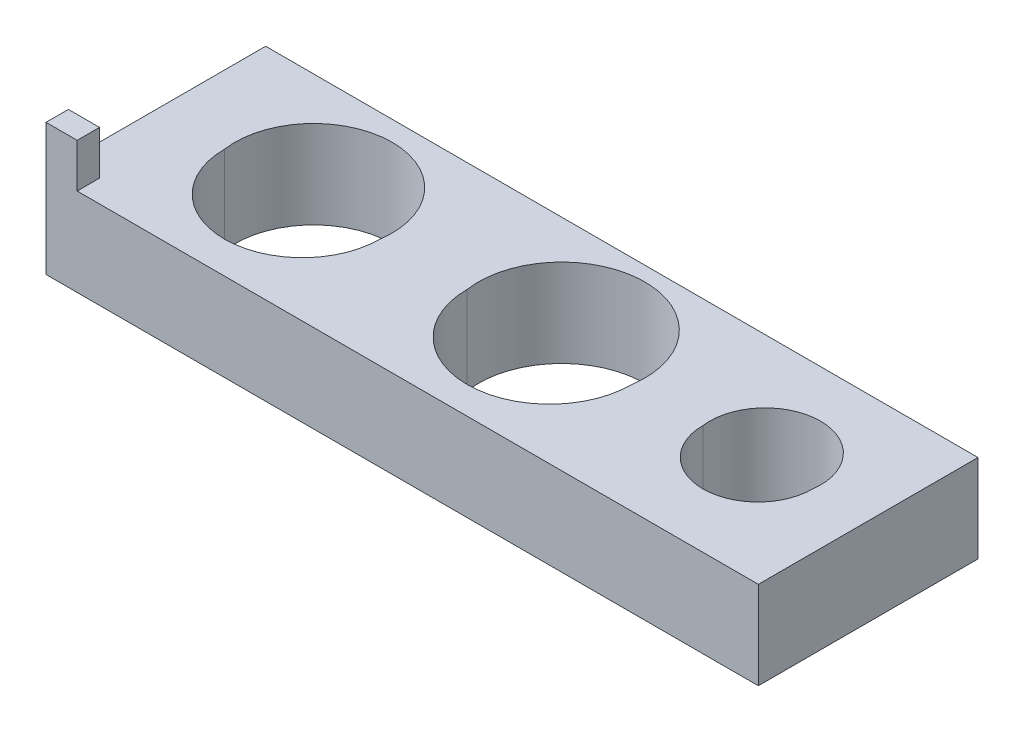
ISO-10303-21;
HEADER;
FILE_DESCRIPTION(('STEP AP214'),'2;1');
FILE_NAME('part.step','',(''),(''),'','','');
FILE_SCHEMA(('AUTOMOTIVE_DESIGN { 1 0 10303 214 1 1 1 1 }'));
ENDSEC;
DATA;
#1=APPLICATION_CONTEXT('core data for automotive mechanical design processes');
#2=APPLICATION_PROTOCOL_DEFINITION('international standard','automotive_design',2000,#1);
#3=PRODUCT_CONTEXT('',#1,'mechanical');
#4=PRODUCT('Part','Part','',(#3));
#5=PRODUCT_RELATED_PRODUCT_CATEGORY('part','',(#4));
#6=PRODUCT_DEFINITION_FORMATION('','',#4);
#7=PRODUCT_DEFINITION_CONTEXT('part definition',#1,'design');
#8=PRODUCT_DEFINITION('design','',#6,#7);
#9=PRODUCT_DEFINITION_SHAPE('','',#8);
#10=(LENGTH_UNIT() NAMED_UNIT(*) SI_UNIT(.MILLI.,.METRE.));
#11=(NAMED_UNIT(*) PLANE_ANGLE_UNIT() SI_UNIT($,.RADIAN.));
#12=(NAMED_UNIT(*) SI_UNIT($,.STERADIAN.) SOLID_ANGLE_UNIT());
#13=UNCERTAINTY_MEASURE_WITH_UNIT(LENGTH_MEASURE(1.E-05),#10,'distance_accuracy_value','');
#14=(GEOMETRIC_REPRESENTATION_CONTEXT(3) GLOBAL_UNCERTAINTY_ASSIGNED_CONTEXT((#13)) GLOBAL_UNIT_ASSIGNED_CONTEXT((#10,
#11,#12)) REPRESENTATION_CONTEXT('',''));
#15=CARTESIAN_POINT('',(0.,0.,0.));
#16=DIRECTION('',(0.,0.,1.));
#17=DIRECTION('',(1.,0.,0.));
#18=AXIS2_PLACEMENT_3D('',#15,#16,#17);
#19=CARTESIAN_POINT('',(31.722464109303,5.08,-6.76655938441402));
#20=DIRECTION('',(0.,-1.,0.));
#21=DIRECTION('',(0.,0.,-1.));
#22=AXIS2_PLACEMENT_3D('',#19,#20,#21);
#23=CYLINDRICAL_SURFACE('',#22,3.2022096622088);
#24=CARTESIAN_POINT('',(31.722464109303,0.,-6.76655938441402));
#25=DIRECTION('',(0.,1.,0.));
#26=DIRECTION('',(0.,0.,1.));
#27=AXIS2_PLACEMENT_3D('',#24,#25,#26);
#28=CIRCLE('',#27,3.2022096622088);
#29=CARTESIAN_POINT('',(28.547464109303,0.,-6.35));
#30=VERTEX_POINT('',#29);
#31=CARTESIAN_POINT('',(34.897464109303,0.,-6.35));
#32=VERTEX_POINT('',#31);
#33=EDGE_CURVE('E234',#30,#32,#28,.F.);
#34=ORIENTED_EDGE('',*,*,#33,.T.);
#35=DIRECTION('',(0.,-1.,0.));
#36=VECTOR('',#35,1.);
#37=CARTESIAN_POINT('',(34.897464109303,5.08,-6.35));
#38=LINE('',#37,#36);
#39=CARTESIAN_POINT('',(34.897464109303,5.08,-6.35));
#40=VERTEX_POINT('',#39);
#41=EDGE_CURVE('E12',#40,#32,#38,.T.);
#42=ORIENTED_EDGE('',*,*,#41,.F.);
#43=CARTESIAN_POINT('',(31.722464109303,5.08,-6.76655938441402));
#44=DIRECTION('',(0.,1.,0.));
#45=DIRECTION('',(0.,0.,1.));
#46=AXIS2_PLACEMENT_3D('',#43,#44,#45);
#47=CIRCLE('',#46,3.2022096622088);
#48=CARTESIAN_POINT('',(28.547464109303,5.08,-6.35));
#49=VERTEX_POINT('',#48);
#50=EDGE_CURVE('E208',#49,#40,#47,.F.);
#51=ORIENTED_EDGE('',*,*,#50,.F.);
#52=DIRECTION('',(0.,-1.,0.));
#53=VECTOR('',#52,1.);
#54=CARTESIAN_POINT('',(28.547464109303,5.08,-6.35));
#55=LINE('',#54,#53);
#56=EDGE_CURVE('E68',#49,#30,#55,.T.);
#57=ORIENTED_EDGE('',*,*,#56,.T.);
#58=EDGE_LOOP('',(#34,#42,#51,#57));
#59=FACE_BOUND('',#58,.T.);
#60=ADVANCED_FACE('F59',(#59),#23,.F.);
#61=CARTESIAN_POINT('',(38.1,5.08,0.));
#62=DIRECTION('',(-1.,0.,0.));
#63=DIRECTION('',(0.,0.,1.));
#64=AXIS2_PLACEMENT_3D('',#61,#62,#63);
#65=PLANE('',#64);
#66=DIRECTION('',(0.,0.,-1.));
#67=VECTOR('',#66,1.);
#68=CARTESIAN_POINT('',(38.1,0.,0.));
#69=LINE('',#68,#67);
#70=CARTESIAN_POINT('',(38.1,0.,0.));
#71=VERTEX_POINT('',#70);
#72=CARTESIAN_POINT('',(38.1,0.,-12.7));
#73=VERTEX_POINT('',#72);
#74=EDGE_CURVE('E226',#71,#73,#69,.T.);
#75=ORIENTED_EDGE('',*,*,#74,.T.);
#76=DIRECTION('',(0.,-1.,0.));
#77=VECTOR('',#76,1.);
#78=CARTESIAN_POINT('',(38.1,5.08,-12.7));
#79=LINE('',#78,#77);
#80=CARTESIAN_POINT('',(38.1,5.08,-12.7));
#81=VERTEX_POINT('',#80);
#82=EDGE_CURVE('E239',#81,#73,#79,.T.);
#83=ORIENTED_EDGE('',*,*,#82,.F.);
#84=DIRECTION('',(0.,0.,-1.));
#85=VECTOR('',#84,1.);
#86=CARTESIAN_POINT('',(38.1,5.08,0.));
#87=LINE('',#86,#85);
#88=CARTESIAN_POINT('',(38.1,5.08,0.));
#89=VERTEX_POINT('',#88);
#90=EDGE_CURVE('E201',#89,#81,#87,.T.);
#91=ORIENTED_EDGE('',*,*,#90,.F.);
#92=DIRECTION('',(0.,-1.,0.));
#93=VECTOR('',#92,1.);
#94=CARTESIAN_POINT('',(38.1,5.08,0.));
#95=LINE('',#94,#93);
#96=EDGE_CURVE('E241',#89,#71,#95,.T.);
#97=ORIENTED_EDGE('',*,*,#96,.T.);
#98=EDGE_LOOP('',(#75,#83,#91,#97));
#99=FACE_BOUND('',#98,.T.);
#100=ADVANCED_FACE('F262',(#99),#65,.F.);
#101=CARTESIAN_POINT('',(0.,5.08,-12.7));
#102=DIRECTION('',(0.,0.,-1.));
#103=DIRECTION('',(-1.,0.,0.));
#104=AXIS2_PLACEMENT_3D('',#101,#102,#103);
#105=PLANE('',#104);
#106=DIRECTION('',(1.,0.,0.));
#107=VECTOR('',#106,1.);
#108=CARTESIAN_POINT('',(0.,0.,-12.7));
#109=LINE('',#108,#107);
#110=CARTESIAN_POINT('',(-3.08576312716724,0.,-12.7));
#111=VERTEX_POINT('',#110);
#112=EDGE_CURVE('E229',#111,#73,#109,.T.);
#113=ORIENTED_EDGE('',*,*,#112,.F.);
#114=DIRECTION('',(0.,-1.,0.));
#115=VECTOR('',#114,1.);
#116=CARTESIAN_POINT('',(-3.08576312716724,5.08,-12.7));
#117=LINE('',#116,#115);
#118=CARTESIAN_POINT('',(-3.08576312716724,5.08,-12.7));
#119=VERTEX_POINT('',#118);
#120=EDGE_CURVE('E163',#119,#111,#117,.T.);
#121=ORIENTED_EDGE('',*,*,#120,.F.);
#122=DIRECTION('',(1.,0.,0.));
#123=VECTOR('',#122,1.);
#124=CARTESIAN_POINT('',(0.,5.08,-12.7));
#125=LINE('',#124,#123);
#126=EDGE_CURVE('E203',#119,#81,#125,.T.);
#127=ORIENTED_EDGE('',*,*,#126,.T.);
#128=ORIENTED_EDGE('',*,*,#82,.T.);
#129=EDGE_LOOP('',(#113,#121,#127,#128));
#130=FACE_BOUND('',#129,.T.);
#131=ADVANCED_FACE('F291',(#130),#105,.T.);
#132=CARTESIAN_POINT('',(5.37983622513507,5.08,-6.35));
#133=DIRECTION('',(0.,-1.,0.));
#134=DIRECTION('',(0.,0.,-1.));
#135=AXIS2_PLACEMENT_3D('',#132,#133,#134);
#136=CYLINDRICAL_SURFACE('',#135,4.5);
#137=CARTESIAN_POINT('',(5.37983622513507,0.,-6.35));
#138=DIRECTION('',(0.,1.,0.));
#139=DIRECTION('',(0.,0.,1.));
#140=AXIS2_PLACEMENT_3D('',#137,#138,#139);
#141=CIRCLE('',#140,4.5);
#142=CARTESIAN_POINT('',(0.879836225135068,0.,-6.35));
#143=VERTEX_POINT('',#142);
#144=CARTESIAN_POINT('',(9.87983622513507,0.,-6.35));
#145=VERTEX_POINT('',#144);
#146=EDGE_CURVE('E220',#143,#145,#141,.T.);
#147=ORIENTED_EDGE('',*,*,#146,.F.);
#148=DIRECTION('',(0.,-1.,0.));
#149=VECTOR('',#148,1.);
#150=CARTESIAN_POINT('',(0.879836225135068,5.08,-6.35));
#151=LINE('',#150,#149);
#152=CARTESIAN_POINT('',(0.879836225135068,5.08,-6.35));
#153=VERTEX_POINT('',#152);
#154=EDGE_CURVE('E244',#153,#143,#151,.T.);
#155=ORIENTED_EDGE('',*,*,#154,.F.);
#156=CARTESIAN_POINT('',(5.37983622513507,5.08,-6.35));
#157=DIRECTION('',(0.,1.,0.));
#158=DIRECTION('',(0.,0.,1.));
#159=AXIS2_PLACEMENT_3D('',#156,#157,#158);
#160=CIRCLE('',#159,4.5);
#161=CARTESIAN_POINT('',(9.87983622513507,5.08,-6.35));
#162=VERTEX_POINT('',#161);
#163=EDGE_CURVE('E196',#153,#162,#160,.T.);
#164=ORIENTED_EDGE('',*,*,#163,.T.);
#165=DIRECTION('',(0.,-1.,0.));
#166=VECTOR('',#165,1.);
#167=CARTESIAN_POINT('',(9.87983622513507,5.08,-6.35));
#168=LINE('',#167,#166);
#169=EDGE_CURVE('E246',#162,#145,#168,.T.);
#170=ORIENTED_EDGE('',*,*,#169,.T.);
#171=EDGE_LOOP('',(#147,#155,#164,#170));
#172=FACE_BOUND('',#171,.T.);
#173=ADVANCED_FACE('F301',(#172),#136,.F.);
#174=CARTESIAN_POINT('',(19.6778662624865,5.08,-6.35));
#175=DIRECTION('',(0.,-1.,0.));
#176=DIRECTION('',(0.,0.,-1.));
#177=AXIS2_PLACEMENT_3D('',#174,#175,#176);
#178=CYLINDRICAL_SURFACE('',#177,4.7625);
#179=CARTESIAN_POINT('',(19.6778662624865,0.,-6.35));
#180=DIRECTION('',(0.,1.,0.));
#181=DIRECTION('',(0.,0.,1.));
#182=AXIS2_PLACEMENT_3D('',#179,#180,#181);
#183=CIRCLE('',#182,4.7625);
#184=CARTESIAN_POINT('',(14.9153662624865,0.,-6.35));
#185=VERTEX_POINT('',#184);
#186=CARTESIAN_POINT('',(24.4403662624865,0.,-6.35));
#187=VERTEX_POINT('',#186);
#188=EDGE_CURVE('E214',#185,#187,#183,.T.);
#189=ORIENTED_EDGE('',*,*,#188,.F.);
#190=DIRECTION('',(0.,-1.,0.));
#191=VECTOR('',#190,1.);
#192=CARTESIAN_POINT('',(14.9153662624865,5.08,-6.35));
#193=LINE('',#192,#191);
#194=CARTESIAN_POINT('',(14.9153662624865,5.08,-6.35));
#195=VERTEX_POINT('',#194);
#196=EDGE_CURVE('E248',#195,#185,#193,.T.);
#197=ORIENTED_EDGE('',*,*,#196,.F.);
#198=CARTESIAN_POINT('',(19.6778662624865,5.08,-6.35));
#199=DIRECTION('',(0.,1.,0.));
#200=DIRECTION('',(0.,0.,1.));
#201=AXIS2_PLACEMENT_3D('',#198,#199,#200);
#202=CIRCLE('',#201,4.7625);
#203=CARTESIAN_POINT('',(24.4403662624865,5.08,-6.35));
#204=VERTEX_POINT('',#203);
#205=EDGE_CURVE('E190',#195,#204,#202,.T.);
#206=ORIENTED_EDGE('',*,*,#205,.T.);
#207=DIRECTION('',(0.,-1.,0.));
#208=VECTOR('',#207,1.);
#209=CARTESIAN_POINT('',(24.4403662624865,5.08,-6.35));
#210=LINE('',#209,#208);
#211=EDGE_CURVE('E213',#204,#187,#210,.T.);
#212=ORIENTED_EDGE('',*,*,#211,.T.);
#213=EDGE_LOOP('',(#189,#197,#206,#212));
#214=FACE_BOUND('',#213,.T.);
#215=ADVANCED_FACE('F299',(#214),#178,.F.);
#216=CARTESIAN_POINT('',(0.,5.08,0.));
#217=DIRECTION('',(0.,0.,-1.));
#218=DIRECTION('',(-1.,0.,0.));
#219=AXIS2_PLACEMENT_3D('',#216,#217,#218);
#220=PLANE('',#219);
#221=DIRECTION('',(1.,0.,0.));
#222=VECTOR('',#221,1.);
#223=CARTESIAN_POINT('',(0.,0.,0.));
#224=LINE('',#223,#222);
#225=CARTESIAN_POINT('',(-3.08576312716724,0.,0.));
#226=VERTEX_POINT('',#225);
#227=EDGE_CURVE('E232',#226,#71,#224,.T.);
#228=ORIENTED_EDGE('',*,*,#227,.T.);
#229=ORIENTED_EDGE('',*,*,#96,.F.);
#230=DIRECTION('',(1.,0.,0.));
#231=VECTOR('',#230,1.);
#232=CARTESIAN_POINT('',(0.,5.08,0.));
#233=LINE('',#232,#231);
#234=CARTESIAN_POINT('',(-1.28391911144377,5.08,0.));
#235=VERTEX_POINT('',#234);
#236=EDGE_CURVE('E206',#235,#89,#233,.T.);
#237=ORIENTED_EDGE('',*,*,#236,.F.);
#238=DIRECTION('',(0.,-1.,0.));
#239=VECTOR('',#238,1.);
#240=CARTESIAN_POINT('',(-1.28391911144377,7.62,0.));
#241=LINE('',#240,#239);
#242=CARTESIAN_POINT('',(-1.28391911144377,7.62,0.));
#243=VERTEX_POINT('',#242);
#244=EDGE_CURVE('E168',#243,#235,#241,.T.);
#245=ORIENTED_EDGE('',*,*,#244,.F.);
#246=DIRECTION('',(1.,0.,0.));
#247=VECTOR('',#246,1.);
#248=CARTESIAN_POINT('',(-3.08576312716724,7.62,0.));
#249=LINE('',#248,#247);
#250=CARTESIAN_POINT('',(-3.08576312716724,7.62,0.));
#251=VERTEX_POINT('',#250);
#252=EDGE_CURVE('E165',#251,#243,#249,.T.);
#253=ORIENTED_EDGE('',*,*,#252,.F.);
#254=DIRECTION('',(0.,-1.,0.));
#255=VECTOR('',#254,1.);
#256=CARTESIAN_POINT('',(-3.08576312716724,5.08,0.));
#257=LINE('',#256,#255);
#258=EDGE_CURVE('E63',#251,#226,#257,.T.);
#259=ORIENTED_EDGE('',*,*,#258,.T.);
#260=EDGE_LOOP('',(#228,#229,#237,#245,#253,#259));
#261=FACE_BOUND('',#260,.T.);
#262=ADVANCED_FACE('F166',(#261),#220,.F.);
#263=CARTESIAN_POINT('',(5.37983622513507,5.08,-7.00288000787659));
#264=DIRECTION('',(0.,-1.,0.));
#265=DIRECTION('',(0.,0.,-1.));
#266=AXIS2_PLACEMENT_3D('',#263,#264,#265);
#267=CYLINDRICAL_SURFACE('',#266,4.54711472306175);
#268=CARTESIAN_POINT('',(5.37983622513507,0.,-7.00288000787659));
#269=DIRECTION('',(0.,1.,0.));
#270=DIRECTION('',(0.,0.,1.));
#271=AXIS2_PLACEMENT_3D('',#268,#269,#270);
#272=CIRCLE('',#271,4.54711472306175);
#273=EDGE_CURVE('E223',#143,#145,#272,.F.);
#274=ORIENTED_EDGE('',*,*,#273,.T.);
#275=ORIENTED_EDGE('',*,*,#169,.F.);
#276=CARTESIAN_POINT('',(5.37983622513507,5.08,-7.00288000787659));
#277=DIRECTION('',(0.,1.,0.));
#278=DIRECTION('',(0.,0.,1.));
#279=AXIS2_PLACEMENT_3D('',#276,#277,#278);
#280=CIRCLE('',#279,4.54711472306175);
#281=EDGE_CURVE('E199',#153,#162,#280,.F.);
#282=ORIENTED_EDGE('',*,*,#281,.F.);
#283=ORIENTED_EDGE('',*,*,#154,.T.);
#284=EDGE_LOOP('',(#274,#275,#282,#283));
#285=FACE_BOUND('',#284,.T.);
#286=ADVANCED_FACE('F298',(#285),#267,.F.);
#287=CARTESIAN_POINT('',(19.6778662624865,5.08,-7.04753058612249));
#288=DIRECTION('',(0.,-1.,0.));
#289=DIRECTION('',(0.,0.,-1.));
#290=AXIS2_PLACEMENT_3D('',#287,#288,#289);
#291=CYLINDRICAL_SURFACE('',#290,4.81331020905326);
#292=CARTESIAN_POINT('',(19.6778662624865,0.,-7.04753058612249));
#293=DIRECTION('',(0.,1.,0.));
#294=DIRECTION('',(0.,0.,1.));
#295=AXIS2_PLACEMENT_3D('',#292,#293,#294);
#296=CIRCLE('',#295,4.81331020905326);
#297=EDGE_CURVE('E217',#185,#187,#296,.F.);
#298=ORIENTED_EDGE('',*,*,#297,.T.);
#299=ORIENTED_EDGE('',*,*,#211,.F.);
#300=CARTESIAN_POINT('',(19.6778662624865,5.08,-7.04753058612249));
#301=DIRECTION('',(0.,1.,0.));
#302=DIRECTION('',(0.,0.,1.));
#303=AXIS2_PLACEMENT_3D('',#300,#301,#302);
#304=CIRCLE('',#303,4.81331020905326);
#305=EDGE_CURVE('E193',#195,#204,#304,.F.);
#306=ORIENTED_EDGE('',*,*,#305,.F.);
#307=ORIENTED_EDGE('',*,*,#196,.T.);
#308=EDGE_LOOP('',(#298,#299,#306,#307));
#309=FACE_BOUND('',#308,.T.);
#310=ADVANCED_FACE('F305',(#309),#291,.F.);
#311=CARTESIAN_POINT('',(31.722464109303,5.08,-6.35));
#312=DIRECTION('',(0.,-1.,0.));
#313=DIRECTION('',(0.,0.,-1.));
#314=AXIS2_PLACEMENT_3D('',#311,#312,#313);
#315=CYLINDRICAL_SURFACE('',#314,3.175);
#316=CARTESIAN_POINT('',(31.722464109303,0.,-6.35));
#317=DIRECTION('',(0.,1.,0.));
#318=DIRECTION('',(0.,0.,1.));
#319=AXIS2_PLACEMENT_3D('',#316,#317,#318);
#320=CIRCLE('',#319,3.175);
#321=EDGE_CURVE('E194',#30,#32,#320,.T.);
#322=ORIENTED_EDGE('',*,*,#321,.F.);
#323=ORIENTED_EDGE('',*,*,#56,.F.);
#324=CARTESIAN_POINT('',(31.722464109303,5.08,-6.35));
#325=DIRECTION('',(0.,1.,0.));
#326=DIRECTION('',(0.,0.,1.));
#327=AXIS2_PLACEMENT_3D('',#324,#325,#326);
#328=CIRCLE('',#327,3.175);
#329=EDGE_CURVE('E210',#49,#40,#328,.T.);
#330=ORIENTED_EDGE('',*,*,#329,.T.);
#331=ORIENTED_EDGE('',*,*,#41,.T.);
#332=EDGE_LOOP('',(#322,#323,#330,#331));
#333=FACE_BOUND('',#332,.T.);
#334=ADVANCED_FACE('F295',(#333),#315,.F.);
#335=CARTESIAN_POINT('',(0.,5.08,0.));
#336=DIRECTION('',(0.,1.,0.));
#337=DIRECTION('',(0.,0.,1.));
#338=AXIS2_PLACEMENT_3D('',#335,#336,#337);
#339=PLANE('',#338);
#340=DIRECTION('',(-1.,0.,0.));
#341=VECTOR('',#340,1.);
#342=CARTESIAN_POINT('',(-3.08576312716724,5.08,-1.29407743261112));
#343=LINE('',#342,#341);
#344=CARTESIAN_POINT('',(-1.28391911144377,5.08,-1.29407743261112));
#345=VERTEX_POINT('',#344);
#346=CARTESIAN_POINT('',(-3.08576312716724,5.08,-1.29407743261112));
#347=VERTEX_POINT('',#346);
#348=EDGE_CURVE('E177',#345,#347,#343,.T.);
#349=ORIENTED_EDGE('',*,*,#348,.F.);
#350=DIRECTION('',(0.,0.,-1.));
#351=VECTOR('',#350,1.);
#352=CARTESIAN_POINT('',(-1.28391911144377,5.08,0.));
#353=LINE('',#352,#351);
#354=EDGE_CURVE('E76',#235,#345,#353,.T.);
#355=ORIENTED_EDGE('',*,*,#354,.F.);
#356=ORIENTED_EDGE('',*,*,#236,.T.);
#357=ORIENTED_EDGE('',*,*,#90,.T.);
#358=ORIENTED_EDGE('',*,*,#126,.F.);
#359=DIRECTION('',(0.,0.,1.));
#360=VECTOR('',#359,1.);
#361=CARTESIAN_POINT('',(-3.08576312716724,5.08,-12.7));
#362=LINE('',#361,#360);
#363=EDGE_CURVE('E82',#119,#347,#362,.T.);
#364=ORIENTED_EDGE('',*,*,#363,.T.);
#365=EDGE_LOOP('',(#349,#355,#356,#357,#358,#364));
#366=FACE_BOUND('',#365,.T.);
#367=ORIENTED_EDGE('',*,*,#205,.F.);
#368=ORIENTED_EDGE('',*,*,#305,.T.);
#369=EDGE_LOOP('',(#367,#368));
#370=FACE_BOUND('',#369,.T.);
#371=ORIENTED_EDGE('',*,*,#163,.F.);
#372=ORIENTED_EDGE('',*,*,#281,.T.);
#373=EDGE_LOOP('',(#371,#372));
#374=FACE_BOUND('',#373,.T.);
#375=ORIENTED_EDGE('',*,*,#50,.T.);
#376=ORIENTED_EDGE('',*,*,#329,.F.);
#377=EDGE_LOOP('',(#375,#376));
#378=FACE_BOUND('',#377,.T.);
#379=ADVANCED_FACE('F264',(#366,#370,#374,#378),#339,.T.);
#380=CARTESIAN_POINT('',(0.,0.,0.));
#381=DIRECTION('',(0.,1.,0.));
#382=DIRECTION('',(0.,0.,1.));
#383=AXIS2_PLACEMENT_3D('',#380,#381,#382);
#384=PLANE('',#383);
#385=ORIENTED_EDGE('',*,*,#188,.T.);
#386=ORIENTED_EDGE('',*,*,#297,.F.);
#387=EDGE_LOOP('',(#385,#386));
#388=FACE_BOUND('',#387,.T.);
#389=ORIENTED_EDGE('',*,*,#146,.T.);
#390=ORIENTED_EDGE('',*,*,#273,.F.);
#391=EDGE_LOOP('',(#389,#390));
#392=FACE_BOUND('',#391,.T.);
#393=ORIENTED_EDGE('',*,*,#74,.F.);
#394=ORIENTED_EDGE('',*,*,#227,.F.);
#395=DIRECTION('',(0.,0.,1.));
#396=VECTOR('',#395,1.);
#397=CARTESIAN_POINT('',(-3.08576312716724,0.,-12.7));
#398=LINE('',#397,#396);
#399=EDGE_CURVE('E161',#111,#226,#398,.T.);
#400=ORIENTED_EDGE('',*,*,#399,.F.);
#401=ORIENTED_EDGE('',*,*,#112,.T.);
#402=EDGE_LOOP('',(#393,#394,#400,#401));
#403=FACE_BOUND('',#402,.T.);
#404=ORIENTED_EDGE('',*,*,#33,.F.);
#405=ORIENTED_EDGE('',*,*,#321,.T.);
#406=EDGE_LOOP('',(#404,#405));
#407=FACE_BOUND('',#406,.T.);
#408=ADVANCED_FACE('F257',(#388,#392,#403,#407),#384,.F.);
#409=CARTESIAN_POINT('',(-3.08576312716724,5.08,-12.7));
#410=DIRECTION('',(1.,0.,0.));
#411=DIRECTION('',(0.,0.,-1.));
#412=AXIS2_PLACEMENT_3D('',#409,#410,#411);
#413=PLANE('',#412);
#414=ORIENTED_EDGE('',*,*,#399,.T.);
#415=ORIENTED_EDGE('',*,*,#258,.F.);
#416=DIRECTION('',(0.,0.,1.));
#417=VECTOR('',#416,1.);
#418=CARTESIAN_POINT('',(-3.08576312716724,7.62,0.));
#419=LINE('',#418,#417);
#420=CARTESIAN_POINT('',(-3.08576312716724,7.62,-1.29407743261112));
#421=VERTEX_POINT('',#420);
#422=EDGE_CURVE('E158',#421,#251,#419,.T.);
#423=ORIENTED_EDGE('',*,*,#422,.F.);
#424=DIRECTION('',(0.,-1.,0.));
#425=VECTOR('',#424,1.);
#426=CARTESIAN_POINT('',(-3.08576312716724,7.62,-1.29407743261112));
#427=LINE('',#426,#425);
#428=EDGE_CURVE('E183',#421,#347,#427,.T.);
#429=ORIENTED_EDGE('',*,*,#428,.T.);
#430=ORIENTED_EDGE('',*,*,#363,.F.);
#431=ORIENTED_EDGE('',*,*,#120,.T.);
#432=EDGE_LOOP('',(#414,#415,#423,#429,#430,#431));
#433=FACE_BOUND('',#432,.T.);
#434=ADVANCED_FACE('F61',(#433),#413,.F.);
#435=CARTESIAN_POINT('',(-1.28391911144377,7.62,0.));
#436=DIRECTION('',(-1.,0.,0.));
#437=DIRECTION('',(0.,0.,1.));
#438=AXIS2_PLACEMENT_3D('',#435,#436,#437);
#439=PLANE('',#438);
#440=ORIENTED_EDGE('',*,*,#354,.T.);
#441=DIRECTION('',(0.,-1.,0.));
#442=VECTOR('',#441,1.);
#443=CARTESIAN_POINT('',(-1.28391911144377,7.62,-1.29407743261112));
#444=LINE('',#443,#442);
#445=CARTESIAN_POINT('',(-1.28391911144377,7.62,-1.29407743261112));
#446=VERTEX_POINT('',#445);
#447=EDGE_CURVE('E186',#446,#345,#444,.T.);
#448=ORIENTED_EDGE('',*,*,#447,.F.);
#449=DIRECTION('',(0.,0.,-1.));
#450=VECTOR('',#449,1.);
#451=CARTESIAN_POINT('',(-1.28391911144377,7.62,0.));
#452=LINE('',#451,#450);
#453=EDGE_CURVE('E171',#243,#446,#452,.T.);
#454=ORIENTED_EDGE('',*,*,#453,.F.);
#455=ORIENTED_EDGE('',*,*,#244,.T.);
#456=EDGE_LOOP('',(#440,#448,#454,#455));
#457=FACE_BOUND('',#456,.T.);
#458=ADVANCED_FACE('F267',(#457),#439,.F.);
#459=CARTESIAN_POINT('',(-3.08576312716724,7.62,-1.29407743261112));
#460=DIRECTION('',(0.,0.,1.));
#461=DIRECTION('',(1.,0.,0.));
#462=AXIS2_PLACEMENT_3D('',#459,#460,#461);
#463=PLANE('',#462);
#464=ORIENTED_EDGE('',*,*,#348,.T.);
#465=ORIENTED_EDGE('',*,*,#428,.F.);
#466=DIRECTION('',(-1.,0.,0.));
#467=VECTOR('',#466,1.);
#468=CARTESIAN_POINT('',(-3.08576312716724,7.62,-1.29407743261112));
#469=LINE('',#468,#467);
#470=EDGE_CURVE('E175',#446,#421,#469,.T.);
#471=ORIENTED_EDGE('',*,*,#470,.F.);
#472=ORIENTED_EDGE('',*,*,#447,.T.);
#473=EDGE_LOOP('',(#464,#465,#471,#472));
#474=FACE_BOUND('',#473,.T.);
#475=ADVANCED_FACE('F270',(#474),#463,.F.);
#476=CARTESIAN_POINT('',(0.,7.62,0.));
#477=DIRECTION('',(0.,-1.,0.));
#478=DIRECTION('',(0.,0.,-1.));
#479=AXIS2_PLACEMENT_3D('',#476,#477,#478);
#480=PLANE('',#479);
#481=ORIENTED_EDGE('',*,*,#422,.T.);
#482=ORIENTED_EDGE('',*,*,#252,.T.);
#483=ORIENTED_EDGE('',*,*,#453,.T.);
#484=ORIENTED_EDGE('',*,*,#470,.T.);
#485=EDGE_LOOP('',(#481,#482,#483,#484));
#486=FACE_BOUND('',#485,.T.);
#487=ADVANCED_FACE('F173',(#486),#480,.F.);
#488=CLOSED_SHELL('',(#60,#100,#131,#173,#215,#262,#286,#310,#334,#379,#408,#434,#458,#475,#487));
#489=MANIFOLD_SOLID_BREP('B2',#488);
#490=ADVANCED_BREP_SHAPE_REPRESENTATION('',(#18,#489),#14);
#491=SHAPE_DEFINITION_REPRESENTATION(#9,#490);
ENDSEC;
END-ISO-10303-21;
